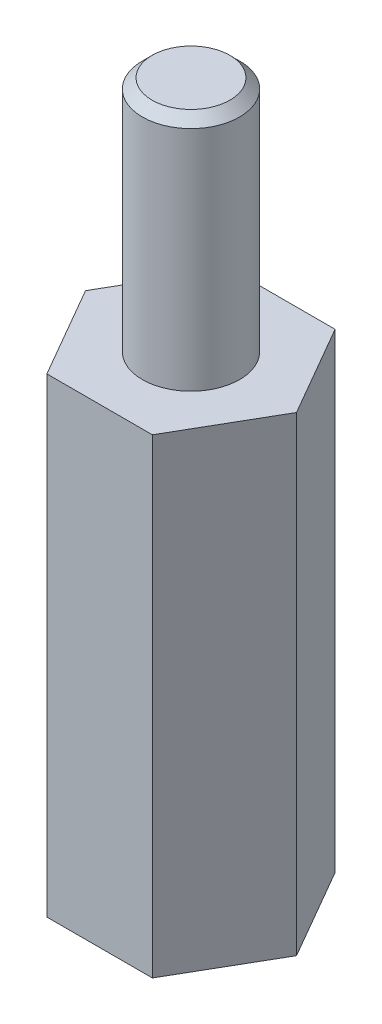
ISO-10303-21;
HEADER;
FILE_DESCRIPTION(('STEP AP214'),'2;1');
FILE_NAME('part.step','',(''),(''),'','','');
FILE_SCHEMA(('AUTOMOTIVE_DESIGN { 1 0 10303 214 1 1 1 1 }'));
ENDSEC;
DATA;
#1=APPLICATION_CONTEXT('core data for automotive mechanical design processes');
#2=APPLICATION_PROTOCOL_DEFINITION('international standard','automotive_design',2000,#1);
#3=PRODUCT_CONTEXT('',#1,'mechanical');
#4=PRODUCT('Part','Part','',(#3));
#5=PRODUCT_RELATED_PRODUCT_CATEGORY('part','',(#4));
#6=PRODUCT_DEFINITION_FORMATION('','',#4);
#7=PRODUCT_DEFINITION_CONTEXT('part definition',#1,'design');
#8=PRODUCT_DEFINITION('design','',#6,#7);
#9=PRODUCT_DEFINITION_SHAPE('','',#8);
#10=(LENGTH_UNIT() NAMED_UNIT(*) SI_UNIT(.MILLI.,.METRE.));
#11=(NAMED_UNIT(*) PLANE_ANGLE_UNIT() SI_UNIT($,.RADIAN.));
#12=(NAMED_UNIT(*) SI_UNIT($,.STERADIAN.) SOLID_ANGLE_UNIT());
#13=UNCERTAINTY_MEASURE_WITH_UNIT(LENGTH_MEASURE(1.E-05),#10,'distance_accuracy_value','');
#14=(GEOMETRIC_REPRESENTATION_CONTEXT(3) GLOBAL_UNCERTAINTY_ASSIGNED_CONTEXT((#13)) GLOBAL_UNIT_ASSIGNED_CONTEXT((#10,
#11,#12)) REPRESENTATION_CONTEXT('',''));
#15=CARTESIAN_POINT('',(0.,0.,0.));
#16=DIRECTION('',(0.,0.,1.));
#17=DIRECTION('',(1.,0.,0.));
#18=AXIS2_PLACEMENT_3D('',#15,#16,#17);
#19=CARTESIAN_POINT('',(1.35677313259562,12.1,2.35));
#20=DIRECTION('',(-0.866025403784439,0.,-0.5));
#21=DIRECTION('',(-0.5,0.,0.866025403784439));
#22=AXIS2_PLACEMENT_3D('',#19,#20,#21);
#23=PLANE('',#22);
#24=DIRECTION('',(0.5,0.,-0.866025403784439));
#25=VECTOR('',#24,1.);
#26=CARTESIAN_POINT('',(1.35677313259562,0.,2.35));
#27=LINE('',#26,#25);
#28=CARTESIAN_POINT('',(1.35677313259562,0.,2.35));
#29=VERTEX_POINT('',#28);
#30=CARTESIAN_POINT('',(2.71354626519124,0.,0.));
#31=VERTEX_POINT('',#30);
#32=EDGE_CURVE('E128',#29,#31,#27,.T.);
#33=ORIENTED_EDGE('',*,*,#32,.T.);
#34=DIRECTION('',(0.,-1.,0.));
#35=VECTOR('',#34,1.);
#36=CARTESIAN_POINT('',(2.71354626519124,12.1,0.));
#37=LINE('',#36,#35);
#38=CARTESIAN_POINT('',(2.71354626519124,12.1,0.));
#39=VERTEX_POINT('',#38);
#40=EDGE_CURVE('E146',#39,#31,#37,.T.);
#41=ORIENTED_EDGE('',*,*,#40,.F.);
#42=DIRECTION('',(0.5,0.,-0.866025403784439));
#43=VECTOR('',#42,1.);
#44=CARTESIAN_POINT('',(1.35677313259562,12.1,2.35));
#45=LINE('',#44,#43);
#46=CARTESIAN_POINT('',(1.35677313259562,12.1,2.35));
#47=VERTEX_POINT('',#46);
#48=EDGE_CURVE('E139',#47,#39,#45,.T.);
#49=ORIENTED_EDGE('',*,*,#48,.F.);
#50=DIRECTION('',(0.,-1.,0.));
#51=VECTOR('',#50,1.);
#52=CARTESIAN_POINT('',(1.35677313259562,12.1,2.35));
#53=LINE('',#52,#51);
#54=EDGE_CURVE('E124',#47,#29,#53,.T.);
#55=ORIENTED_EDGE('',*,*,#54,.T.);
#56=EDGE_LOOP('',(#33,#41,#49,#55));
#57=FACE_BOUND('',#56,.T.);
#58=ADVANCED_FACE('F41',(#57),#23,.F.);
#59=CARTESIAN_POINT('',(2.71354626519124,12.1,0.));
#60=DIRECTION('',(-0.866025403784438,0.,0.5));
#61=DIRECTION('',(0.5,0.,0.866025403784439));
#62=AXIS2_PLACEMENT_3D('',#59,#60,#61);
#63=PLANE('',#62);
#64=DIRECTION('',(-0.5,0.,-0.866025403784438));
#65=VECTOR('',#64,1.);
#66=CARTESIAN_POINT('',(2.71354626519124,0.,0.));
#67=LINE('',#66,#65);
#68=CARTESIAN_POINT('',(1.35677313259562,0.,-2.35));
#69=VERTEX_POINT('',#68);
#70=EDGE_CURVE('E131',#31,#69,#67,.T.);
#71=ORIENTED_EDGE('',*,*,#70,.T.);
#72=DIRECTION('',(0.,-1.,0.));
#73=VECTOR('',#72,1.);
#74=CARTESIAN_POINT('',(1.35677313259562,12.1,-2.35));
#75=LINE('',#74,#73);
#76=CARTESIAN_POINT('',(1.35677313259562,12.1,-2.35));
#77=VERTEX_POINT('',#76);
#78=EDGE_CURVE('E143',#77,#69,#75,.T.);
#79=ORIENTED_EDGE('',*,*,#78,.F.);
#80=DIRECTION('',(-0.5,0.,-0.866025403784438));
#81=VECTOR('',#80,1.);
#82=CARTESIAN_POINT('',(2.71354626519124,12.1,0.));
#83=LINE('',#82,#81);
#84=EDGE_CURVE('E97',#39,#77,#83,.T.);
#85=ORIENTED_EDGE('',*,*,#84,.F.);
#86=ORIENTED_EDGE('',*,*,#40,.T.);
#87=EDGE_LOOP('',(#71,#79,#85,#86));
#88=FACE_BOUND('',#87,.T.);
#89=ADVANCED_FACE('F162',(#88),#63,.F.);
#90=CARTESIAN_POINT('',(1.35677313259562,12.1,-2.35));
#91=DIRECTION('',(0.,0.,1.));
#92=DIRECTION('',(1.,0.,0.));
#93=AXIS2_PLACEMENT_3D('',#90,#91,#92);
#94=PLANE('',#93);
#95=DIRECTION('',(-1.,0.,0.));
#96=VECTOR('',#95,1.);
#97=CARTESIAN_POINT('',(1.35677313259562,0.,-2.35));
#98=LINE('',#97,#96);
#99=CARTESIAN_POINT('',(-1.35677313259562,0.,-2.35));
#100=VERTEX_POINT('',#99);
#101=EDGE_CURVE('E134',#69,#100,#98,.T.);
#102=ORIENTED_EDGE('',*,*,#101,.T.);
#103=DIRECTION('',(0.,-1.,0.));
#104=VECTOR('',#103,1.);
#105=CARTESIAN_POINT('',(-1.35677313259562,12.1,-2.35));
#106=LINE('',#105,#104);
#107=CARTESIAN_POINT('',(-1.35677313259562,12.1,-2.35));
#108=VERTEX_POINT('',#107);
#109=EDGE_CURVE('E119',#108,#100,#106,.T.);
#110=ORIENTED_EDGE('',*,*,#109,.F.);
#111=DIRECTION('',(-1.,0.,0.));
#112=VECTOR('',#111,1.);
#113=CARTESIAN_POINT('',(1.35677313259562,12.1,-2.35));
#114=LINE('',#113,#112);
#115=EDGE_CURVE('E110',#77,#108,#114,.T.);
#116=ORIENTED_EDGE('',*,*,#115,.F.);
#117=ORIENTED_EDGE('',*,*,#78,.T.);
#118=EDGE_LOOP('',(#102,#110,#116,#117));
#119=FACE_BOUND('',#118,.T.);
#120=ADVANCED_FACE('F165',(#119),#94,.F.);
#121=CARTESIAN_POINT('',(-1.35677313259562,12.1,-2.35));
#122=DIRECTION('',(0.866025403784439,0.,0.5));
#123=DIRECTION('',(0.5,0.,-0.866025403784439));
#124=AXIS2_PLACEMENT_3D('',#121,#122,#123);
#125=PLANE('',#124);
#126=DIRECTION('',(-0.5,0.,0.866025403784439));
#127=VECTOR('',#126,1.);
#128=CARTESIAN_POINT('',(-1.35677313259562,0.,-2.35));
#129=LINE('',#128,#127);
#130=CARTESIAN_POINT('',(-2.71354626519124,0.,0.));
#131=VERTEX_POINT('',#130);
#132=EDGE_CURVE('E118',#100,#131,#129,.T.);
#133=ORIENTED_EDGE('',*,*,#132,.T.);
#134=DIRECTION('',(0.,-1.,0.));
#135=VECTOR('',#134,1.);
#136=CARTESIAN_POINT('',(-2.71354626519124,12.1,0.));
#137=LINE('',#136,#135);
#138=CARTESIAN_POINT('',(-2.71354626519124,12.1,0.));
#139=VERTEX_POINT('',#138);
#140=EDGE_CURVE('E115',#139,#131,#137,.T.);
#141=ORIENTED_EDGE('',*,*,#140,.F.);
#142=DIRECTION('',(-0.5,0.,0.866025403784439));
#143=VECTOR('',#142,1.);
#144=CARTESIAN_POINT('',(-1.35677313259562,12.1,-2.35));
#145=LINE('',#144,#143);
#146=EDGE_CURVE('E104',#108,#139,#145,.T.);
#147=ORIENTED_EDGE('',*,*,#146,.F.);
#148=ORIENTED_EDGE('',*,*,#109,.T.);
#149=EDGE_LOOP('',(#133,#141,#147,#148));
#150=FACE_BOUND('',#149,.T.);
#151=ADVANCED_FACE('F116',(#150),#125,.F.);
#152=CARTESIAN_POINT('',(-2.71354626519124,12.1,0.));
#153=DIRECTION('',(0.866025403784438,0.,-0.5));
#154=DIRECTION('',(-0.5,0.,-0.866025403784439));
#155=AXIS2_PLACEMENT_3D('',#152,#153,#154);
#156=PLANE('',#155);
#157=DIRECTION('',(0.5,0.,0.866025403784438));
#158=VECTOR('',#157,1.);
#159=CARTESIAN_POINT('',(-2.71354626519124,0.,0.));
#160=LINE('',#159,#158);
#161=CARTESIAN_POINT('',(-1.35677313259562,0.,2.35));
#162=VERTEX_POINT('',#161);
#163=EDGE_CURVE('E82',#131,#162,#160,.T.);
#164=ORIENTED_EDGE('',*,*,#163,.T.);
#165=DIRECTION('',(0.,-1.,0.));
#166=VECTOR('',#165,1.);
#167=CARTESIAN_POINT('',(-1.35677313259562,12.1,2.35));
#168=LINE('',#167,#166);
#169=CARTESIAN_POINT('',(-1.35677313259562,12.1,2.35));
#170=VERTEX_POINT('',#169);
#171=EDGE_CURVE('E120',#170,#162,#168,.T.);
#172=ORIENTED_EDGE('',*,*,#171,.F.);
#173=DIRECTION('',(0.5,0.,0.866025403784438));
#174=VECTOR('',#173,1.);
#175=CARTESIAN_POINT('',(-2.71354626519124,12.1,0.));
#176=LINE('',#175,#174);
#177=EDGE_CURVE('E108',#139,#170,#176,.T.);
#178=ORIENTED_EDGE('',*,*,#177,.F.);
#179=ORIENTED_EDGE('',*,*,#140,.T.);
#180=EDGE_LOOP('',(#164,#172,#178,#179));
#181=FACE_BOUND('',#180,.T.);
#182=ADVANCED_FACE('F122',(#181),#156,.F.);
#183=CARTESIAN_POINT('',(-1.35677313259562,12.1,2.35));
#184=DIRECTION('',(0.,0.,-1.));
#185=DIRECTION('',(-1.,0.,0.));
#186=AXIS2_PLACEMENT_3D('',#183,#184,#185);
#187=PLANE('',#186);
#188=DIRECTION('',(1.,0.,0.));
#189=VECTOR('',#188,1.);
#190=CARTESIAN_POINT('',(-1.35677313259562,0.,2.35));
#191=LINE('',#190,#189);
#192=EDGE_CURVE('E88',#162,#29,#191,.T.);
#193=ORIENTED_EDGE('',*,*,#192,.T.);
#194=ORIENTED_EDGE('',*,*,#54,.F.);
#195=DIRECTION('',(1.,0.,0.));
#196=VECTOR('',#195,1.);
#197=CARTESIAN_POINT('',(-1.35677313259562,12.1,2.35));
#198=LINE('',#197,#196);
#199=EDGE_CURVE('E59',#170,#47,#198,.T.);
#200=ORIENTED_EDGE('',*,*,#199,.F.);
#201=ORIENTED_EDGE('',*,*,#171,.T.);
#202=EDGE_LOOP('',(#193,#194,#200,#201));
#203=FACE_BOUND('',#202,.T.);
#204=ADVANCED_FACE('F170',(#203),#187,.F.);
#205=CARTESIAN_POINT('',(0.,12.1,0.));
#206=DIRECTION('',(0.,1.,0.));
#207=DIRECTION('',(0.,0.,1.));
#208=AXIS2_PLACEMENT_3D('',#205,#206,#207);
#209=PLANE('',#208);
#210=CARTESIAN_POINT('',(0.,12.1,0.));
#211=DIRECTION('',(0.,1.,0.));
#212=DIRECTION('',(0.,0.,1.));
#213=AXIS2_PLACEMENT_3D('',#210,#211,#212);
#214=CIRCLE('',#213,1.25);
#215=CARTESIAN_POINT('',(0.,12.1,1.25));
#216=VERTEX_POINT('',#215);
#217=EDGE_CURVE('E147',#216,#216,#214,.T.);
#218=ORIENTED_EDGE('',*,*,#217,.F.);
#219=EDGE_LOOP('',(#218));
#220=FACE_BOUND('',#219,.T.);
#221=ORIENTED_EDGE('',*,*,#48,.T.);
#222=ORIENTED_EDGE('',*,*,#84,.T.);
#223=ORIENTED_EDGE('',*,*,#115,.T.);
#224=ORIENTED_EDGE('',*,*,#146,.T.);
#225=ORIENTED_EDGE('',*,*,#177,.T.);
#226=ORIENTED_EDGE('',*,*,#199,.T.);
#227=EDGE_LOOP('',(#221,#222,#223,#224,#225,#226));
#228=FACE_BOUND('',#227,.T.);
#229=ADVANCED_FACE('F106',(#220,#228),#209,.T.);
#230=CARTESIAN_POINT('',(0.,0.,0.));
#231=DIRECTION('',(0.,1.,0.));
#232=DIRECTION('',(0.,0.,1.));
#233=AXIS2_PLACEMENT_3D('',#230,#231,#232);
#234=PLANE('',#233);
#235=CARTESIAN_POINT('',(0.,0.,0.));
#236=DIRECTION('',(0.,-1.,0.));
#237=DIRECTION('',(0.,0.,-1.));
#238=AXIS2_PLACEMENT_3D('',#235,#236,#237);
#239=CIRCLE('',#238,1.25);
#240=CARTESIAN_POINT('',(0.,0.,-1.25));
#241=VERTEX_POINT('',#240);
#242=EDGE_CURVE('E157',#241,#241,#239,.T.);
#243=ORIENTED_EDGE('',*,*,#242,.F.);
#244=EDGE_LOOP('',(#243));
#245=FACE_BOUND('',#244,.T.);
#246=ORIENTED_EDGE('',*,*,#32,.F.);
#247=ORIENTED_EDGE('',*,*,#192,.F.);
#248=ORIENTED_EDGE('',*,*,#163,.F.);
#249=ORIENTED_EDGE('',*,*,#132,.F.);
#250=ORIENTED_EDGE('',*,*,#101,.F.);
#251=ORIENTED_EDGE('',*,*,#70,.F.);
#252=EDGE_LOOP('',(#246,#247,#248,#249,#250,#251));
#253=FACE_BOUND('',#252,.T.);
#254=ADVANCED_FACE('F168',(#245,#253),#234,.F.);
#255=CARTESIAN_POINT('',(0.,18.2,0.));
#256=DIRECTION('',(0.,-1.,0.));
#257=DIRECTION('',(0.,0.,-1.));
#258=AXIS2_PLACEMENT_3D('',#255,#256,#257);
#259=CYLINDRICAL_SURFACE('',#258,1.25);
#260=CARTESIAN_POINT('',(0.,17.95,0.));
#261=DIRECTION('',(0.,1.,0.));
#262=DIRECTION('',(0.,0.,1.));
#263=AXIS2_PLACEMENT_3D('',#260,#261,#262);
#264=CIRCLE('',#263,1.25);
#265=CARTESIAN_POINT('',(0.,17.95,1.25));
#266=VERTEX_POINT('',#265);
#267=EDGE_CURVE('E11',#266,#266,#264,.F.);
#268=ORIENTED_EDGE('',*,*,#267,.T.);
#269=EDGE_LOOP('',(#268));
#270=FACE_BOUND('',#269,.T.);
#271=ORIENTED_EDGE('',*,*,#217,.T.);
#272=EDGE_LOOP('',(#271));
#273=FACE_BOUND('',#272,.T.);
#274=ADVANCED_FACE('F220',(#270,#273),#259,.T.);
#275=CARTESIAN_POINT('',(0.,18.2,0.));
#276=DIRECTION('',(0.,1.,0.));
#277=DIRECTION('',(0.,0.,1.));
#278=AXIS2_PLACEMENT_3D('',#275,#276,#277);
#279=PLANE('',#278);
#280=CARTESIAN_POINT('',(0.,18.2,0.));
#281=DIRECTION('',(0.,1.,0.));
#282=DIRECTION('',(0.,0.,1.));
#283=AXIS2_PLACEMENT_3D('',#280,#281,#282);
#284=CIRCLE('',#283,0.999999999999994);
#285=CARTESIAN_POINT('',(0.,18.2,0.999999999999994));
#286=VERTEX_POINT('',#285);
#287=EDGE_CURVE('E51',#286,#286,#284,.T.);
#288=ORIENTED_EDGE('',*,*,#287,.T.);
#289=EDGE_LOOP('',(#288));
#290=FACE_BOUND('',#289,.T.);
#291=ADVANCED_FACE('F230',(#290),#279,.T.);
#292=CARTESIAN_POINT('',(0.,18.2,0.));
#293=DIRECTION('',(0.,-1.,0.));
#294=DIRECTION('',(0.,0.,-1.));
#295=AXIS2_PLACEMENT_3D('',#292,#293,#294);
#296=CONICAL_SURFACE('',#295,0.999999999999994,0.785398163397453);
#297=ORIENTED_EDGE('',*,*,#267,.F.);
#298=EDGE_LOOP('',(#297));
#299=FACE_BOUND('',#298,.T.);
#300=ORIENTED_EDGE('',*,*,#287,.F.);
#301=EDGE_LOOP('',(#300));
#302=FACE_BOUND('',#301,.T.);
#303=ADVANCED_FACE('F44',(#299,#302),#296,.T.);
#304=CARTESIAN_POINT('',(0.,10.,0.));
#305=DIRECTION('',(0.,-1.,0.));
#306=DIRECTION('',(0.,0.,-1.));
#307=AXIS2_PLACEMENT_3D('',#304,#305,#306);
#308=CYLINDRICAL_SURFACE('',#307,1.25);
#309=CARTESIAN_POINT('',(0.,10.,0.));
#310=DIRECTION('',(0.,-1.,0.));
#311=DIRECTION('',(0.,0.,-1.));
#312=AXIS2_PLACEMENT_3D('',#309,#310,#311);
#313=CIRCLE('',#312,1.25);
#314=CARTESIAN_POINT('',(0.,10.,-1.25));
#315=VERTEX_POINT('',#314);
#316=EDGE_CURVE('E132',#315,#315,#313,.T.);
#317=ORIENTED_EDGE('',*,*,#316,.F.);
#318=EDGE_LOOP('',(#317));
#319=FACE_BOUND('',#318,.T.);
#320=ORIENTED_EDGE('',*,*,#242,.T.);
#321=EDGE_LOOP('',(#320));
#322=FACE_BOUND('',#321,.T.);
#323=ADVANCED_FACE('F247',(#319,#322),#308,.F.);
#324=CARTESIAN_POINT('',(0.,10.,0.));
#325=DIRECTION('',(0.,-1.,0.));
#326=DIRECTION('',(0.,0.,-1.));
#327=AXIS2_PLACEMENT_3D('',#324,#325,#326);
#328=PLANE('',#327);
#329=ORIENTED_EDGE('',*,*,#316,.T.);
#330=EDGE_LOOP('',(#329));
#331=FACE_BOUND('',#330,.T.);
#332=ADVANCED_FACE('F255',(#331),#328,.T.);
#333=CLOSED_SHELL('',(#58,#89,#120,#151,#182,#204,#229,#254,#274,#291,#303,#323,#332));
#334=MANIFOLD_SOLID_BREP('B2',#333);
#335=ADVANCED_BREP_SHAPE_REPRESENTATION('',(#18,#334),#14);
#336=SHAPE_DEFINITION_REPRESENTATION(#9,#335);
ENDSEC;
END-ISO-10303-21;
